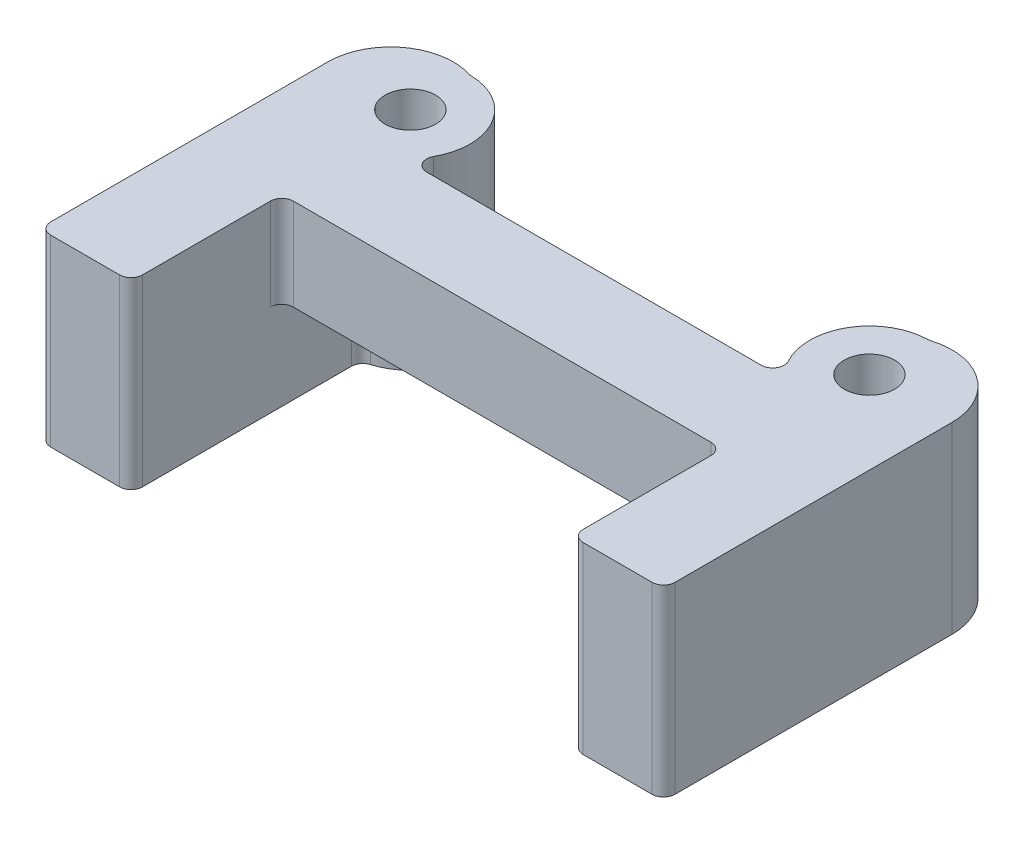
ISO-10303-21;
HEADER;
FILE_DESCRIPTION(('STEP AP214'),'2;1');
FILE_NAME('part.step','',(''),(''),'','','');
FILE_SCHEMA(('AUTOMOTIVE_DESIGN { 1 0 10303 214 1 1 1 1 }'));
ENDSEC;
DATA;
#1=APPLICATION_CONTEXT('core data for automotive mechanical design processes');
#2=APPLICATION_PROTOCOL_DEFINITION('international standard','automotive_design',2000,#1);
#3=PRODUCT_CONTEXT('',#1,'mechanical');
#4=PRODUCT('Part','Part','',(#3));
#5=PRODUCT_RELATED_PRODUCT_CATEGORY('part','',(#4));
#6=PRODUCT_DEFINITION_FORMATION('','',#4);
#7=PRODUCT_DEFINITION_CONTEXT('part definition',#1,'design');
#8=PRODUCT_DEFINITION('design','',#6,#7);
#9=PRODUCT_DEFINITION_SHAPE('','',#8);
#10=(LENGTH_UNIT() NAMED_UNIT(*) SI_UNIT(.MILLI.,.METRE.));
#11=(NAMED_UNIT(*) PLANE_ANGLE_UNIT() SI_UNIT($,.RADIAN.));
#12=(NAMED_UNIT(*) SI_UNIT($,.STERADIAN.) SOLID_ANGLE_UNIT());
#13=UNCERTAINTY_MEASURE_WITH_UNIT(LENGTH_MEASURE(1.E-05),#10,'distance_accuracy_value','');
#14=(GEOMETRIC_REPRESENTATION_CONTEXT(3) GLOBAL_UNCERTAINTY_ASSIGNED_CONTEXT((#13)) GLOBAL_UNIT_ASSIGNED_CONTEXT((#10,
#11,#12)) REPRESENTATION_CONTEXT('',''));
#15=CARTESIAN_POINT('',(0.,0.,0.));
#16=DIRECTION('',(0.,0.,1.));
#17=DIRECTION('',(1.,0.,0.));
#18=AXIS2_PLACEMENT_3D('',#15,#16,#17);
#19=CARTESIAN_POINT('',(0.861111111111111,8.,0.));
#20=DIRECTION('',(0.,-1.,0.));
#21=DIRECTION('',(0.,0.,-1.));
#22=AXIS2_PLACEMENT_3D('',#19,#20,#21);
#23=PLANE('',#22);
#24=DIRECTION('',(1.,0.,0.));
#25=VECTOR('',#24,1.);
#26=CARTESIAN_POINT('',(3.6,8.,12.569046515733));
#27=LINE('',#26,#25);
#28=CARTESIAN_POINT('',(0.0999999999999998,8.,12.569046515733));
#29=VERTEX_POINT('',#28);
#30=CARTESIAN_POINT('',(3.1,8.,12.569046515733));
#31=VERTEX_POINT('',#30);
#32=EDGE_CURVE('E318',#29,#31,#27,.T.);
#33=ORIENTED_EDGE('',*,*,#32,.T.);
#34=CARTESIAN_POINT('',(3.1,8.,12.069046515733));
#35=DIRECTION('',(0.,-1.,0.));
#36=DIRECTION('',(0.,0.,-1.));
#37=AXIS2_PLACEMENT_3D('',#34,#35,#36);
#38=CIRCLE('',#37,0.5);
#39=CARTESIAN_POINT('',(3.6,8.,12.069046515733));
#40=VERTEX_POINT('',#39);
#41=EDGE_CURVE('E434',#31,#40,#38,.F.);
#42=ORIENTED_EDGE('',*,*,#41,.T.);
#43=DIRECTION('',(0.,0.,-1.));
#44=VECTOR('',#43,1.);
#45=CARTESIAN_POINT('',(3.6,8.,0.));
#46=LINE('',#45,#44);
#47=CARTESIAN_POINT('',(3.6,8.,0.));
#48=VERTEX_POINT('',#47);
#49=EDGE_CURVE('E321',#40,#48,#46,.T.);
#50=ORIENTED_EDGE('',*,*,#49,.T.);
#51=CARTESIAN_POINT('',(0.861111111111111,8.,0.));
#52=DIRECTION('',(0.,1.,0.));
#53=DIRECTION('',(0.,0.,-1.));
#54=AXIS2_PLACEMENT_3D('',#51,#52,#53);
#55=CIRCLE('',#54,2.73888888888889);
#56=CARTESIAN_POINT('',(0.0647374536601564,8.,-2.62055363299384));
#57=VERTEX_POINT('',#56);
#58=EDGE_CURVE('E305',#48,#57,#55,.T.);
#59=ORIENTED_EDGE('',*,*,#58,.T.);
#60=CARTESIAN_POINT('',(-0.0806451612903224,8.,-3.098950847942));
#61=DIRECTION('',(0.,-1.,0.));
#62=DIRECTION('',(0.,0.,-1.));
#63=AXIS2_PLACEMENT_3D('',#60,#61,#62);
#64=CIRCLE('',#63,0.5);
#65=CARTESIAN_POINT('',(-0.0676378772112381,8.,-2.59912006601587));
#66=VERTEX_POINT('',#65);
#67=EDGE_CURVE('E465',#57,#66,#64,.T.);
#68=ORIENTED_EDGE('',*,*,#67,.T.);
#69=CARTESIAN_POINT('',(0.,8.,0.));
#70=DIRECTION('',(0.,1.,0.));
#71=DIRECTION('',(0.,0.,1.));
#72=AXIS2_PLACEMENT_3D('',#69,#70,#71);
#73=CIRCLE('',#72,2.6);
#74=CARTESIAN_POINT('',(-2.27536231691944,8.,1.25806451612903));
#75=VERTEX_POINT('',#74);
#76=EDGE_CURVE('E309',#66,#75,#73,.T.);
#77=ORIENTED_EDGE('',*,*,#76,.T.);
#78=CARTESIAN_POINT('',(-2.71293199325011,8.,1.5));
#79=DIRECTION('',(0.,-1.,0.));
#80=DIRECTION('',(0.,0.,-1.));
#81=AXIS2_PLACEMENT_3D('',#78,#79,#80);
#82=CIRCLE('',#81,0.5);
#83=CARTESIAN_POINT('',(-2.71293199325011,8.,2.));
#84=VERTEX_POINT('',#83);
#85=EDGE_CURVE('E480',#75,#84,#82,.T.);
#86=ORIENTED_EDGE('',*,*,#85,.T.);
#87=DIRECTION('',(-1.,0.,0.));
#88=VECTOR('',#87,1.);
#89=CARTESIAN_POINT('',(0.,8.,2.));
#90=LINE('',#89,#88);
#91=CARTESIAN_POINT('',(-17.2870680067499,8.,2.));
#92=VERTEX_POINT('',#91);
#93=EDGE_CURVE('E279',#84,#92,#90,.T.);
#94=ORIENTED_EDGE('',*,*,#93,.T.);
#95=CARTESIAN_POINT('',(-17.2870680067499,8.,1.5));
#96=DIRECTION('',(0.,-1.,0.));
#97=DIRECTION('',(0.,0.,-1.));
#98=AXIS2_PLACEMENT_3D('',#95,#96,#97);
#99=CIRCLE('',#98,0.5);
#100=CARTESIAN_POINT('',(-17.7246376830806,8.,1.25806451612904));
#101=VERTEX_POINT('',#100);
#102=EDGE_CURVE('E474',#92,#101,#99,.T.);
#103=ORIENTED_EDGE('',*,*,#102,.T.);
#104=CARTESIAN_POINT('',(-20.,8.,0.));
#105=DIRECTION('',(0.,-1.,0.));
#106=DIRECTION('',(0.,0.,1.));
#107=AXIS2_PLACEMENT_3D('',#104,#105,#106);
#108=CIRCLE('',#107,2.6);
#109=CARTESIAN_POINT('',(-19.9323621227888,8.,-2.59912006601587));
#110=VERTEX_POINT('',#109);
#111=EDGE_CURVE('E241',#110,#101,#108,.T.);
#112=ORIENTED_EDGE('',*,*,#111,.F.);
#113=CARTESIAN_POINT('',(-19.9193548387097,8.,-3.098950847942));
#114=DIRECTION('',(0.,-1.,0.));
#115=DIRECTION('',(0.,0.,-1.));
#116=AXIS2_PLACEMENT_3D('',#113,#114,#115);
#117=CIRCLE('',#116,0.5);
#118=CARTESIAN_POINT('',(-20.0647374536602,8.,-2.62055363299384));
#119=VERTEX_POINT('',#118);
#120=EDGE_CURVE('E239',#110,#119,#117,.T.);
#121=ORIENTED_EDGE('',*,*,#120,.T.);
#122=CARTESIAN_POINT('',(-20.8611111111111,8.,0.));
#123=DIRECTION('',(0.,-1.,0.));
#124=DIRECTION('',(0.,0.,-1.));
#125=AXIS2_PLACEMENT_3D('',#122,#123,#124);
#126=CIRCLE('',#125,2.73888888888889);
#127=CARTESIAN_POINT('',(-23.6,8.,0.));
#128=VERTEX_POINT('',#127);
#129=EDGE_CURVE('E228',#128,#119,#126,.T.);
#130=ORIENTED_EDGE('',*,*,#129,.F.);
#131=DIRECTION('',(0.,0.,-1.));
#132=VECTOR('',#131,1.);
#133=CARTESIAN_POINT('',(-23.6,8.,0.));
#134=LINE('',#133,#132);
#135=CARTESIAN_POINT('',(-23.6,8.,12.069046515733));
#136=VERTEX_POINT('',#135);
#137=EDGE_CURVE('E212',#136,#128,#134,.T.);
#138=ORIENTED_EDGE('',*,*,#137,.F.);
#139=CARTESIAN_POINT('',(-23.1,8.,12.069046515733));
#140=DIRECTION('',(0.,-1.,0.));
#141=DIRECTION('',(0.,0.,-1.));
#142=AXIS2_PLACEMENT_3D('',#139,#140,#141);
#143=CIRCLE('',#142,0.5);
#144=CARTESIAN_POINT('',(-23.1,8.,12.569046515733));
#145=VERTEX_POINT('',#144);
#146=EDGE_CURVE('E428',#136,#145,#143,.F.);
#147=ORIENTED_EDGE('',*,*,#146,.T.);
#148=DIRECTION('',(-1.,0.,0.));
#149=VECTOR('',#148,1.);
#150=CARTESIAN_POINT('',(-23.6,8.,12.569046515733));
#151=LINE('',#150,#149);
#152=CARTESIAN_POINT('',(-20.1,8.,12.569046515733));
#153=VERTEX_POINT('',#152);
#154=EDGE_CURVE('E222',#153,#145,#151,.T.);
#155=ORIENTED_EDGE('',*,*,#154,.F.);
#156=CARTESIAN_POINT('',(-20.1,8.,12.069046515733));
#157=DIRECTION('',(0.,-1.,0.));
#158=DIRECTION('',(0.,0.,-1.));
#159=AXIS2_PLACEMENT_3D('',#156,#157,#158);
#160=CIRCLE('',#159,0.5);
#161=CARTESIAN_POINT('',(-19.6,8.,12.069046515733));
#162=VERTEX_POINT('',#161);
#163=EDGE_CURVE('E425',#153,#162,#160,.F.);
#164=ORIENTED_EDGE('',*,*,#163,.T.);
#165=DIRECTION('',(0.,0.,1.));
#166=VECTOR('',#165,1.);
#167=CARTESIAN_POINT('',(-19.6,8.,12.569046515733));
#168=LINE('',#167,#166);
#169=CARTESIAN_POINT('',(-19.6,8.,6.5));
#170=VERTEX_POINT('',#169);
#171=EDGE_CURVE('E247',#170,#162,#168,.T.);
#172=ORIENTED_EDGE('',*,*,#171,.F.);
#173=CARTESIAN_POINT('',(-19.1,8.,6.5));
#174=DIRECTION('',(0.,-1.,0.));
#175=DIRECTION('',(0.,0.,-1.));
#176=AXIS2_PLACEMENT_3D('',#173,#174,#175);
#177=CIRCLE('',#176,0.5);
#178=CARTESIAN_POINT('',(-19.1,8.,6.));
#179=VERTEX_POINT('',#178);
#180=EDGE_CURVE('E47',#170,#179,#177,.T.);
#181=ORIENTED_EDGE('',*,*,#180,.T.);
#182=DIRECTION('',(1.,0.,0.));
#183=VECTOR('',#182,1.);
#184=CARTESIAN_POINT('',(0.,8.,6.));
#185=LINE('',#184,#183);
#186=CARTESIAN_POINT('',(-0.9,8.,6.));
#187=VERTEX_POINT('',#186);
#188=EDGE_CURVE('E233',#179,#187,#185,.T.);
#189=ORIENTED_EDGE('',*,*,#188,.T.);
#190=CARTESIAN_POINT('',(-0.9,8.,6.5));
#191=DIRECTION('',(0.,-1.,0.));
#192=DIRECTION('',(0.,0.,-1.));
#193=AXIS2_PLACEMENT_3D('',#190,#191,#192);
#194=CIRCLE('',#193,0.5);
#195=CARTESIAN_POINT('',(-0.4,8.,6.5));
#196=VERTEX_POINT('',#195);
#197=EDGE_CURVE('E487',#187,#196,#194,.T.);
#198=ORIENTED_EDGE('',*,*,#197,.T.);
#199=DIRECTION('',(0.,0.,1.));
#200=VECTOR('',#199,1.);
#201=CARTESIAN_POINT('',(-0.4,8.,12.569046515733));
#202=LINE('',#201,#200);
#203=CARTESIAN_POINT('',(-0.4,8.,12.069046515733));
#204=VERTEX_POINT('',#203);
#205=EDGE_CURVE('E314',#196,#204,#202,.T.);
#206=ORIENTED_EDGE('',*,*,#205,.T.);
#207=CARTESIAN_POINT('',(0.0999999999999998,8.,12.069046515733));
#208=DIRECTION('',(0.,-1.,0.));
#209=DIRECTION('',(0.,0.,-1.));
#210=AXIS2_PLACEMENT_3D('',#207,#208,#209);
#211=CIRCLE('',#210,0.5);
#212=EDGE_CURVE('E431',#204,#29,#211,.F.);
#213=ORIENTED_EDGE('',*,*,#212,.T.);
#214=EDGE_LOOP('',(#33,#42,#50,#59,#68,#77,#86,#94,#103,#112,#121,#130,#138,#147,#155,#164,#172,
#181,#189,#198,#206,#213));
#215=FACE_BOUND('',#214,.T.);
#216=CARTESIAN_POINT('',(0.,8.,0.));
#217=DIRECTION('',(0.,1.,0.));
#218=DIRECTION('',(0.,0.,1.));
#219=AXIS2_PLACEMENT_3D('',#216,#217,#218);
#220=CIRCLE('',#219,1.1);
#221=CARTESIAN_POINT('',(0.,8.,1.1));
#222=VERTEX_POINT('',#221);
#223=EDGE_CURVE('E297',#222,#222,#220,.T.);
#224=ORIENTED_EDGE('',*,*,#223,.F.);
#225=EDGE_LOOP('',(#224));
#226=FACE_BOUND('',#225,.T.);
#227=CARTESIAN_POINT('',(-20.,8.,0.));
#228=DIRECTION('',(0.,-1.,0.));
#229=DIRECTION('',(0.,0.,1.));
#230=AXIS2_PLACEMENT_3D('',#227,#228,#229);
#231=CIRCLE('',#230,1.1);
#232=CARTESIAN_POINT('',(-20.,8.,1.1));
#233=VERTEX_POINT('',#232);
#234=EDGE_CURVE('E264',#233,#233,#231,.T.);
#235=ORIENTED_EDGE('',*,*,#234,.T.);
#236=EDGE_LOOP('',(#235));
#237=FACE_BOUND('',#236,.T.);
#238=ADVANCED_FACE('F38',(#215,#226,#237),#23,.F.);
#239=CARTESIAN_POINT('',(0.861111111111111,0.,0.));
#240=DIRECTION('',(0.,-1.,0.));
#241=DIRECTION('',(0.,0.,-1.));
#242=AXIS2_PLACEMENT_3D('',#239,#240,#241);
#243=PLANE('',#242);
#244=DIRECTION('',(0.,0.,-1.));
#245=VECTOR('',#244,1.);
#246=CARTESIAN_POINT('',(3.6,0.,0.));
#247=LINE('',#246,#245);
#248=CARTESIAN_POINT('',(3.6,0.,12.069046515733));
#249=VERTEX_POINT('',#248);
#250=CARTESIAN_POINT('',(3.6,0.,0.));
#251=VERTEX_POINT('',#250);
#252=EDGE_CURVE('E310',#249,#251,#247,.T.);
#253=ORIENTED_EDGE('',*,*,#252,.F.);
#254=CARTESIAN_POINT('',(3.1,0.,12.069046515733));
#255=DIRECTION('',(0.,-1.,0.));
#256=DIRECTION('',(0.,0.,-1.));
#257=AXIS2_PLACEMENT_3D('',#254,#255,#256);
#258=CIRCLE('',#257,0.5);
#259=CARTESIAN_POINT('',(3.1,0.,12.569046515733));
#260=VERTEX_POINT('',#259);
#261=EDGE_CURVE('E415',#249,#260,#258,.T.);
#262=ORIENTED_EDGE('',*,*,#261,.T.);
#263=DIRECTION('',(1.,0.,0.));
#264=VECTOR('',#263,1.);
#265=CARTESIAN_POINT('',(3.6,0.,12.569046515733));
#266=LINE('',#265,#264);
#267=CARTESIAN_POINT('',(0.0999999999999998,0.,12.569046515733));
#268=VERTEX_POINT('',#267);
#269=EDGE_CURVE('E336',#268,#260,#266,.T.);
#270=ORIENTED_EDGE('',*,*,#269,.F.);
#271=CARTESIAN_POINT('',(0.0999999999999998,0.,12.069046515733));
#272=DIRECTION('',(0.,-1.,0.));
#273=DIRECTION('',(0.,0.,-1.));
#274=AXIS2_PLACEMENT_3D('',#271,#272,#273);
#275=CIRCLE('',#274,0.5);
#276=CARTESIAN_POINT('',(-0.4,0.,12.069046515733));
#277=VERTEX_POINT('',#276);
#278=EDGE_CURVE('E412',#268,#277,#275,.T.);
#279=ORIENTED_EDGE('',*,*,#278,.T.);
#280=DIRECTION('',(0.,0.,1.));
#281=VECTOR('',#280,1.);
#282=CARTESIAN_POINT('',(-0.4,0.,12.569046515733));
#283=LINE('',#282,#281);
#284=CARTESIAN_POINT('',(-0.4,0.,2.96647939483827));
#285=VERTEX_POINT('',#284);
#286=EDGE_CURVE('E332',#285,#277,#283,.T.);
#287=ORIENTED_EDGE('',*,*,#286,.F.);
#288=CARTESIAN_POINT('',(-0.9,0.,2.96647939483827));
#289=DIRECTION('',(0.,-1.,0.));
#290=DIRECTION('',(0.,0.,-1.));
#291=AXIS2_PLACEMENT_3D('',#288,#289,#290);
#292=CIRCLE('',#291,0.5);
#293=CARTESIAN_POINT('',(-0.75483870967742,0.,2.48801497631596));
#294=VERTEX_POINT('',#293);
#295=EDGE_CURVE('E468',#285,#294,#292,.F.);
#296=ORIENTED_EDGE('',*,*,#295,.T.);
#297=CARTESIAN_POINT('',(0.,0.,0.));
#298=DIRECTION('',(0.,1.,0.));
#299=DIRECTION('',(0.,0.,1.));
#300=AXIS2_PLACEMENT_3D('',#297,#298,#299);
#301=CIRCLE('',#300,2.6);
#302=CARTESIAN_POINT('',(-0.0676378772112381,0.,-2.59912006601587));
#303=VERTEX_POINT('',#302);
#304=EDGE_CURVE('E328',#303,#294,#301,.T.);
#305=ORIENTED_EDGE('',*,*,#304,.F.);
#306=CARTESIAN_POINT('',(-0.0806451612903224,0.,-3.098950847942));
#307=DIRECTION('',(0.,-1.,0.));
#308=DIRECTION('',(0.,0.,-1.));
#309=AXIS2_PLACEMENT_3D('',#306,#307,#308);
#310=CIRCLE('',#309,0.5);
#311=CARTESIAN_POINT('',(0.0647374536601564,0.,-2.62055363299384));
#312=VERTEX_POINT('',#311);
#313=EDGE_CURVE('E462',#303,#312,#310,.F.);
#314=ORIENTED_EDGE('',*,*,#313,.T.);
#315=CARTESIAN_POINT('',(0.861111111111111,0.,0.));
#316=DIRECTION('',(0.,1.,0.));
#317=DIRECTION('',(0.,0.,-1.));
#318=AXIS2_PLACEMENT_3D('',#315,#316,#317);
#319=CIRCLE('',#318,2.73888888888889);
#320=EDGE_CURVE('E301',#251,#312,#319,.T.);
#321=ORIENTED_EDGE('',*,*,#320,.F.);
#322=EDGE_LOOP('',(#253,#262,#270,#279,#287,#296,#305,#314,#321));
#323=FACE_BOUND('',#322,.T.);
#324=CARTESIAN_POINT('',(0.,0.,0.));
#325=DIRECTION('',(0.,1.,0.));
#326=DIRECTION('',(0.,0.,1.));
#327=AXIS2_PLACEMENT_3D('',#324,#325,#326);
#328=CIRCLE('',#327,1.1);
#329=CARTESIAN_POINT('',(0.,0.,1.1));
#330=VERTEX_POINT('',#329);
#331=EDGE_CURVE('E290',#330,#330,#328,.T.);
#332=ORIENTED_EDGE('',*,*,#331,.T.);
#333=EDGE_LOOP('',(#332));
#334=FACE_BOUND('',#333,.T.);
#335=ADVANCED_FACE('F552',(#323,#334),#243,.T.);
#336=CARTESIAN_POINT('',(0.861111111111111,8.,0.));
#337=DIRECTION('',(0.,-1.,0.));
#338=DIRECTION('',(0.,0.,-1.));
#339=AXIS2_PLACEMENT_3D('',#336,#337,#338);
#340=CYLINDRICAL_SURFACE('',#339,2.73888888888889);
#341=ORIENTED_EDGE('',*,*,#320,.T.);
#342=DIRECTION('',(0.,-1.,0.));
#343=VECTOR('',#342,1.);
#344=CARTESIAN_POINT('',(0.0647374536601561,8.,-2.62055363299384));
#345=LINE('',#344,#343);
#346=EDGE_CURVE('E370',#312,#57,#345,.F.);
#347=ORIENTED_EDGE('',*,*,#346,.T.);
#348=ORIENTED_EDGE('',*,*,#58,.F.);
#349=DIRECTION('',(0.,-1.,0.));
#350=VECTOR('',#349,1.);
#351=CARTESIAN_POINT('',(3.6,8.,0.));
#352=LINE('',#351,#350);
#353=EDGE_CURVE('E324',#48,#251,#352,.T.);
#354=ORIENTED_EDGE('',*,*,#353,.T.);
#355=EDGE_LOOP('',(#341,#347,#348,#354));
#356=FACE_BOUND('',#355,.T.);
#357=ADVANCED_FACE('F540',(#356),#340,.T.);
#358=CARTESIAN_POINT('',(0.,8.,0.));
#359=DIRECTION('',(0.,-1.,0.));
#360=DIRECTION('',(0.,0.,-1.));
#361=AXIS2_PLACEMENT_3D('',#358,#359,#360);
#362=CYLINDRICAL_SURFACE('',#361,2.6);
#363=ORIENTED_EDGE('',*,*,#76,.F.);
#364=DIRECTION('',(0.,-1.,0.));
#365=VECTOR('',#364,1.);
#366=CARTESIAN_POINT('',(-0.0676378772112381,8.,-2.59912006601587));
#367=LINE('',#366,#365);
#368=EDGE_CURVE('E366',#66,#303,#367,.T.);
#369=ORIENTED_EDGE('',*,*,#368,.T.);
#370=ORIENTED_EDGE('',*,*,#304,.T.);
#371=DIRECTION('',(0.,-1.,0.));
#372=VECTOR('',#371,1.);
#373=CARTESIAN_POINT('',(-0.75483870967742,8.,2.48801497631596));
#374=LINE('',#373,#372);
#375=CARTESIAN_POINT('',(-0.75483870967742,4.,2.48801497631596));
#376=VERTEX_POINT('',#375);
#377=EDGE_CURVE('E363',#294,#376,#374,.F.);
#378=ORIENTED_EDGE('',*,*,#377,.T.);
#379=CARTESIAN_POINT('',(0.,4.,0.));
#380=DIRECTION('',(0.,1.,0.));
#381=DIRECTION('',(0.,0.,1.));
#382=AXIS2_PLACEMENT_3D('',#379,#380,#381);
#383=CIRCLE('',#382,2.6);
#384=CARTESIAN_POINT('',(-2.27536231691944,4.,1.25806451612903));
#385=VERTEX_POINT('',#384);
#386=EDGE_CURVE('E282',#385,#376,#383,.T.);
#387=ORIENTED_EDGE('',*,*,#386,.F.);
#388=DIRECTION('',(0.,-1.,0.));
#389=VECTOR('',#388,1.);
#390=CARTESIAN_POINT('',(-2.27536231691944,8.,1.25806451612903));
#391=LINE('',#390,#389);
#392=EDGE_CURVE('E359',#385,#75,#391,.F.);
#393=ORIENTED_EDGE('',*,*,#392,.T.);
#394=EDGE_LOOP('',(#363,#369,#370,#378,#387,#393));
#395=FACE_BOUND('',#394,.T.);
#396=ADVANCED_FACE('F549',(#395),#362,.T.);
#397=CARTESIAN_POINT('',(-0.4,8.,12.569046515733));
#398=DIRECTION('',(1.,0.,0.));
#399=DIRECTION('',(0.,0.,-1.));
#400=AXIS2_PLACEMENT_3D('',#397,#398,#399);
#401=PLANE('',#400);
#402=DIRECTION('',(0.,0.,1.));
#403=VECTOR('',#402,1.);
#404=CARTESIAN_POINT('',(-0.4,4.,0.));
#405=LINE('',#404,#403);
#406=CARTESIAN_POINT('',(-0.4,4.,2.96647939483827));
#407=VERTEX_POINT('',#406);
#408=CARTESIAN_POINT('',(-0.4,4.,6.5));
#409=VERTEX_POINT('',#408);
#410=EDGE_CURVE('E278',#407,#409,#405,.T.);
#411=ORIENTED_EDGE('',*,*,#410,.F.);
#412=DIRECTION('',(0.,1.,0.));
#413=VECTOR('',#412,1.);
#414=CARTESIAN_POINT('',(-0.4,0.,2.96647939483827));
#415=LINE('',#414,#413);
#416=EDGE_CURVE('E380',#407,#285,#415,.F.);
#417=ORIENTED_EDGE('',*,*,#416,.T.);
#418=ORIENTED_EDGE('',*,*,#286,.T.);
#419=DIRECTION('',(0.,-1.,0.));
#420=VECTOR('',#419,1.);
#421=CARTESIAN_POINT('',(-0.4,8.,12.069046515733));
#422=LINE('',#421,#420);
#423=EDGE_CURVE('E377',#277,#204,#422,.F.);
#424=ORIENTED_EDGE('',*,*,#423,.T.);
#425=ORIENTED_EDGE('',*,*,#205,.F.);
#426=DIRECTION('',(0.,1.,0.));
#427=VECTOR('',#426,1.);
#428=CARTESIAN_POINT('',(-0.4,8.,6.5));
#429=LINE('',#428,#427);
#430=EDGE_CURVE('E373',#196,#409,#429,.F.);
#431=ORIENTED_EDGE('',*,*,#430,.T.);
#432=EDGE_LOOP('',(#411,#417,#418,#424,#425,#431));
#433=FACE_BOUND('',#432,.T.);
#434=ADVANCED_FACE('F517',(#433),#401,.F.);
#435=CARTESIAN_POINT('',(3.6,8.,12.569046515733));
#436=DIRECTION('',(0.,0.,-1.));
#437=DIRECTION('',(-1.,0.,0.));
#438=AXIS2_PLACEMENT_3D('',#435,#436,#437);
#439=PLANE('',#438);
#440=ORIENTED_EDGE('',*,*,#269,.T.);
#441=DIRECTION('',(0.,-1.,0.));
#442=VECTOR('',#441,1.);
#443=CARTESIAN_POINT('',(3.1,8.,12.569046515733));
#444=LINE('',#443,#442);
#445=EDGE_CURVE('E422',#260,#31,#444,.F.);
#446=ORIENTED_EDGE('',*,*,#445,.T.);
#447=ORIENTED_EDGE('',*,*,#32,.F.);
#448=DIRECTION('',(0.,-1.,0.));
#449=VECTOR('',#448,1.);
#450=CARTESIAN_POINT('',(0.0999999999999998,8.,12.569046515733));
#451=LINE('',#450,#449);
#452=EDGE_CURVE('E418',#29,#268,#451,.T.);
#453=ORIENTED_EDGE('',*,*,#452,.T.);
#454=EDGE_LOOP('',(#440,#446,#447,#453));
#455=FACE_BOUND('',#454,.T.);
#456=ADVANCED_FACE('F526',(#455),#439,.F.);
#457=CARTESIAN_POINT('',(3.6,8.,0.));
#458=DIRECTION('',(-1.,0.,0.));
#459=DIRECTION('',(0.,0.,1.));
#460=AXIS2_PLACEMENT_3D('',#457,#458,#459);
#461=PLANE('',#460);
#462=ORIENTED_EDGE('',*,*,#49,.F.);
#463=DIRECTION('',(0.,-1.,0.));
#464=VECTOR('',#463,1.);
#465=CARTESIAN_POINT('',(3.6,8.,12.069046515733));
#466=LINE('',#465,#464);
#467=EDGE_CURVE('E408',#40,#249,#466,.T.);
#468=ORIENTED_EDGE('',*,*,#467,.T.);
#469=ORIENTED_EDGE('',*,*,#252,.T.);
#470=ORIENTED_EDGE('',*,*,#353,.F.);
#471=EDGE_LOOP('',(#462,#468,#469,#470));
#472=FACE_BOUND('',#471,.T.);
#473=ADVANCED_FACE('F535',(#472),#461,.F.);
#474=CARTESIAN_POINT('',(0.,8.,0.));
#475=DIRECTION('',(0.,-1.,0.));
#476=DIRECTION('',(0.,0.,-1.));
#477=AXIS2_PLACEMENT_3D('',#474,#475,#476);
#478=CYLINDRICAL_SURFACE('',#477,1.1);
#479=ORIENTED_EDGE('',*,*,#223,.T.);
#480=EDGE_LOOP('',(#479));
#481=FACE_BOUND('',#480,.T.);
#482=ORIENTED_EDGE('',*,*,#331,.F.);
#483=EDGE_LOOP('',(#482));
#484=FACE_BOUND('',#483,.T.);
#485=ADVANCED_FACE('F587',(#481,#484),#478,.F.);
#486=CARTESIAN_POINT('',(0.,4.,2.));
#487=DIRECTION('',(0.,0.,-1.));
#488=DIRECTION('',(-1.,0.,0.));
#489=AXIS2_PLACEMENT_3D('',#486,#487,#488);
#490=PLANE('',#489);
#491=DIRECTION('',(-1.,0.,0.));
#492=VECTOR('',#491,1.);
#493=CARTESIAN_POINT('',(0.,4.,2.));
#494=LINE('',#493,#492);
#495=CARTESIAN_POINT('',(-2.71293199325011,4.,2.));
#496=VERTEX_POINT('',#495);
#497=CARTESIAN_POINT('',(-17.2870680067499,4.,2.));
#498=VERTEX_POINT('',#497);
#499=EDGE_CURVE('E286',#496,#498,#494,.T.);
#500=ORIENTED_EDGE('',*,*,#499,.T.);
#501=DIRECTION('',(0.,-1.,0.));
#502=VECTOR('',#501,1.);
#503=CARTESIAN_POINT('',(-17.2870680067499,4.,2.));
#504=LINE('',#503,#502);
#505=EDGE_CURVE('E404',#498,#92,#504,.F.);
#506=ORIENTED_EDGE('',*,*,#505,.T.);
#507=ORIENTED_EDGE('',*,*,#93,.F.);
#508=DIRECTION('',(0.,-1.,0.));
#509=VECTOR('',#508,1.);
#510=CARTESIAN_POINT('',(-2.71293199325011,4.,2.));
#511=LINE('',#510,#509);
#512=EDGE_CURVE('E401',#84,#496,#511,.T.);
#513=ORIENTED_EDGE('',*,*,#512,.T.);
#514=EDGE_LOOP('',(#500,#506,#507,#513));
#515=FACE_BOUND('',#514,.T.);
#516=ADVANCED_FACE('F565',(#515),#490,.T.);
#517=CARTESIAN_POINT('',(0.,4.,6.));
#518=DIRECTION('',(0.,0.,1.));
#519=DIRECTION('',(1.,0.,0.));
#520=AXIS2_PLACEMENT_3D('',#517,#518,#519);
#521=PLANE('',#520);
#522=DIRECTION('',(1.,0.,0.));
#523=VECTOR('',#522,1.);
#524=CARTESIAN_POINT('',(0.,4.,6.));
#525=LINE('',#524,#523);
#526=CARTESIAN_POINT('',(-19.1,4.,6.));
#527=VERTEX_POINT('',#526);
#528=CARTESIAN_POINT('',(-0.9,4.,6.));
#529=VERTEX_POINT('',#528);
#530=EDGE_CURVE('E274',#527,#529,#525,.T.);
#531=ORIENTED_EDGE('',*,*,#530,.T.);
#532=DIRECTION('',(0.,1.,0.));
#533=VECTOR('',#532,1.);
#534=CARTESIAN_POINT('',(-0.9,4.,6.));
#535=LINE('',#534,#533);
#536=EDGE_CURVE('E440',#529,#187,#535,.T.);
#537=ORIENTED_EDGE('',*,*,#536,.T.);
#538=ORIENTED_EDGE('',*,*,#188,.F.);
#539=DIRECTION('',(0.,1.,0.));
#540=VECTOR('',#539,1.);
#541=CARTESIAN_POINT('',(-19.1,4.,6.));
#542=LINE('',#541,#540);
#543=EDGE_CURVE('E437',#179,#527,#542,.F.);
#544=ORIENTED_EDGE('',*,*,#543,.T.);
#545=EDGE_LOOP('',(#531,#537,#538,#544));
#546=FACE_BOUND('',#545,.T.);
#547=ADVANCED_FACE('F499',(#546),#521,.T.);
#548=CARTESIAN_POINT('',(0.,4.,0.));
#549=DIRECTION('',(0.,1.,0.));
#550=DIRECTION('',(0.,0.,1.));
#551=AXIS2_PLACEMENT_3D('',#548,#549,#550);
#552=PLANE('',#551);
#553=ORIENTED_EDGE('',*,*,#386,.T.);
#554=CARTESIAN_POINT('',(-0.9,4.,2.96647939483827));
#555=DIRECTION('',(0.,1.,0.));
#556=DIRECTION('',(0.,0.,1.));
#557=AXIS2_PLACEMENT_3D('',#554,#555,#556);
#558=CIRCLE('',#557,0.5);
#559=EDGE_CURVE('E387',#376,#407,#558,.F.);
#560=ORIENTED_EDGE('',*,*,#559,.T.);
#561=ORIENTED_EDGE('',*,*,#410,.T.);
#562=CARTESIAN_POINT('',(-0.9,4.,6.5));
#563=DIRECTION('',(0.,1.,0.));
#564=DIRECTION('',(0.,0.,1.));
#565=AXIS2_PLACEMENT_3D('',#562,#563,#564);
#566=CIRCLE('',#565,0.5);
#567=EDGE_CURVE('E490',#409,#529,#566,.T.);
#568=ORIENTED_EDGE('',*,*,#567,.T.);
#569=ORIENTED_EDGE('',*,*,#530,.F.);
#570=CARTESIAN_POINT('',(-19.1,4.,6.5));
#571=DIRECTION('',(0.,1.,0.));
#572=DIRECTION('',(0.,0.,1.));
#573=AXIS2_PLACEMENT_3D('',#570,#571,#572);
#574=CIRCLE('',#573,0.5);
#575=CARTESIAN_POINT('',(-19.6,4.,6.5));
#576=VERTEX_POINT('',#575);
#577=EDGE_CURVE('E11',#527,#576,#574,.T.);
#578=ORIENTED_EDGE('',*,*,#577,.T.);
#579=DIRECTION('',(0.,0.,1.));
#580=VECTOR('',#579,1.);
#581=CARTESIAN_POINT('',(-19.6,4.,0.));
#582=LINE('',#581,#580);
#583=CARTESIAN_POINT('',(-19.6,4.,2.96647939483826));
#584=VERTEX_POINT('',#583);
#585=EDGE_CURVE('E507',#584,#576,#582,.T.);
#586=ORIENTED_EDGE('',*,*,#585,.F.);
#587=CARTESIAN_POINT('',(-19.1,4.,2.96647939483826));
#588=DIRECTION('',(0.,1.,0.));
#589=DIRECTION('',(0.,0.,1.));
#590=AXIS2_PLACEMENT_3D('',#587,#588,#589);
#591=CIRCLE('',#590,0.5);
#592=CARTESIAN_POINT('',(-19.2451612903226,4.,2.48801497631596));
#593=VERTEX_POINT('',#592);
#594=EDGE_CURVE('E384',#584,#593,#591,.F.);
#595=ORIENTED_EDGE('',*,*,#594,.T.);
#596=CARTESIAN_POINT('',(-20.,4.,0.));
#597=DIRECTION('',(0.,-1.,0.));
#598=DIRECTION('',(0.,0.,1.));
#599=AXIS2_PLACEMENT_3D('',#596,#597,#598);
#600=CIRCLE('',#599,2.6);
#601=CARTESIAN_POINT('',(-17.7246376830806,4.,1.25806451612904));
#602=VERTEX_POINT('',#601);
#603=EDGE_CURVE('E616',#602,#593,#600,.T.);
#604=ORIENTED_EDGE('',*,*,#603,.F.);
#605=CARTESIAN_POINT('',(-17.2870680067499,4.,1.5));
#606=DIRECTION('',(0.,1.,0.));
#607=DIRECTION('',(0.,0.,1.));
#608=AXIS2_PLACEMENT_3D('',#605,#606,#607);
#609=CIRCLE('',#608,0.5);
#610=EDGE_CURVE('E477',#602,#498,#609,.T.);
#611=ORIENTED_EDGE('',*,*,#610,.T.);
#612=ORIENTED_EDGE('',*,*,#499,.F.);
#613=CARTESIAN_POINT('',(-2.71293199325011,4.,1.5));
#614=DIRECTION('',(0.,1.,0.));
#615=DIRECTION('',(0.,0.,1.));
#616=AXIS2_PLACEMENT_3D('',#613,#614,#615);
#617=CIRCLE('',#616,0.5);
#618=EDGE_CURVE('E483',#496,#385,#617,.T.);
#619=ORIENTED_EDGE('',*,*,#618,.T.);
#620=EDGE_LOOP('',(#553,#560,#561,#568,#569,#578,#586,#595,#604,#611,#612,#619));
#621=FACE_BOUND('',#620,.T.);
#622=ADVANCED_FACE('F506',(#621),#552,.F.);
#623=CARTESIAN_POINT('',(-20.8611111111111,0.,0.));
#624=DIRECTION('',(0.,-1.,0.));
#625=DIRECTION('',(0.,0.,-1.));
#626=AXIS2_PLACEMENT_3D('',#623,#624,#625);
#627=PLANE('',#626);
#628=DIRECTION('',(-1.,0.,0.));
#629=VECTOR('',#628,1.);
#630=CARTESIAN_POINT('',(-23.6,0.,12.569046515733));
#631=LINE('',#630,#629);
#632=CARTESIAN_POINT('',(-20.1,0.,12.569046515733));
#633=VERTEX_POINT('',#632);
#634=CARTESIAN_POINT('',(-23.1,0.,12.569046515733));
#635=VERTEX_POINT('',#634);
#636=EDGE_CURVE('E249',#633,#635,#631,.T.);
#637=ORIENTED_EDGE('',*,*,#636,.T.);
#638=CARTESIAN_POINT('',(-23.1,0.,12.069046515733));
#639=DIRECTION('',(0.,-1.,0.));
#640=DIRECTION('',(0.,0.,-1.));
#641=AXIS2_PLACEMENT_3D('',#638,#639,#640);
#642=CIRCLE('',#641,0.5);
#643=CARTESIAN_POINT('',(-23.6,0.,12.069046515733));
#644=VERTEX_POINT('',#643);
#645=EDGE_CURVE('E54',#635,#644,#642,.T.);
#646=ORIENTED_EDGE('',*,*,#645,.T.);
#647=DIRECTION('',(0.,0.,-1.));
#648=VECTOR('',#647,1.);
#649=CARTESIAN_POINT('',(-23.6,0.,0.));
#650=LINE('',#649,#648);
#651=CARTESIAN_POINT('',(-23.6,0.,0.));
#652=VERTEX_POINT('',#651);
#653=EDGE_CURVE('E242',#644,#652,#650,.T.);
#654=ORIENTED_EDGE('',*,*,#653,.T.);
#655=CARTESIAN_POINT('',(-20.8611111111111,0.,0.));
#656=DIRECTION('',(0.,-1.,0.));
#657=DIRECTION('',(0.,0.,-1.));
#658=AXIS2_PLACEMENT_3D('',#655,#656,#657);
#659=CIRCLE('',#658,2.73888888888889);
#660=CARTESIAN_POINT('',(-20.0647374536602,0.,-2.62055363299384));
#661=VERTEX_POINT('',#660);
#662=EDGE_CURVE('E231',#652,#661,#659,.T.);
#663=ORIENTED_EDGE('',*,*,#662,.T.);
#664=CARTESIAN_POINT('',(-19.9193548387097,0.,-3.098950847942));
#665=DIRECTION('',(0.,-1.,0.));
#666=DIRECTION('',(0.,0.,-1.));
#667=AXIS2_PLACEMENT_3D('',#664,#665,#666);
#668=CIRCLE('',#667,0.5);
#669=CARTESIAN_POINT('',(-19.9323621227888,0.,-2.59912006601587));
#670=VERTEX_POINT('',#669);
#671=EDGE_CURVE('E457',#661,#670,#668,.F.);
#672=ORIENTED_EDGE('',*,*,#671,.T.);
#673=CARTESIAN_POINT('',(-20.,0.,0.));
#674=DIRECTION('',(0.,-1.,0.));
#675=DIRECTION('',(0.,0.,1.));
#676=AXIS2_PLACEMENT_3D('',#673,#674,#675);
#677=CIRCLE('',#676,2.6);
#678=CARTESIAN_POINT('',(-19.2451612903226,0.,2.48801497631596));
#679=VERTEX_POINT('',#678);
#680=EDGE_CURVE('E263',#670,#679,#677,.T.);
#681=ORIENTED_EDGE('',*,*,#680,.T.);
#682=CARTESIAN_POINT('',(-19.1,0.,2.96647939483826));
#683=DIRECTION('',(0.,-1.,0.));
#684=DIRECTION('',(0.,0.,-1.));
#685=AXIS2_PLACEMENT_3D('',#682,#683,#684);
#686=CIRCLE('',#685,0.5);
#687=CARTESIAN_POINT('',(-19.6,0.,2.96647939483826));
#688=VERTEX_POINT('',#687);
#689=EDGE_CURVE('E471',#679,#688,#686,.F.);
#690=ORIENTED_EDGE('',*,*,#689,.T.);
#691=DIRECTION('',(0.,0.,1.));
#692=VECTOR('',#691,1.);
#693=CARTESIAN_POINT('',(-19.6,0.,12.569046515733));
#694=LINE('',#693,#692);
#695=CARTESIAN_POINT('',(-19.6,0.,12.069046515733));
#696=VERTEX_POINT('',#695);
#697=EDGE_CURVE('E268',#688,#696,#694,.T.);
#698=ORIENTED_EDGE('',*,*,#697,.T.);
#699=CARTESIAN_POINT('',(-20.1,0.,12.069046515733));
#700=DIRECTION('',(0.,-1.,0.));
#701=DIRECTION('',(0.,0.,-1.));
#702=AXIS2_PLACEMENT_3D('',#699,#700,#701);
#703=CIRCLE('',#702,0.5);
#704=EDGE_CURVE('E450',#696,#633,#703,.T.);
#705=ORIENTED_EDGE('',*,*,#704,.T.);
#706=EDGE_LOOP('',(#637,#646,#654,#663,#672,#681,#690,#698,#705));
#707=FACE_BOUND('',#706,.T.);
#708=CARTESIAN_POINT('',(-20.,0.,0.));
#709=DIRECTION('',(0.,-1.,0.));
#710=DIRECTION('',(0.,0.,1.));
#711=AXIS2_PLACEMENT_3D('',#708,#709,#710);
#712=CIRCLE('',#711,1.1);
#713=CARTESIAN_POINT('',(-20.,0.,1.1));
#714=VERTEX_POINT('',#713);
#715=EDGE_CURVE('E252',#714,#714,#712,.T.);
#716=ORIENTED_EDGE('',*,*,#715,.F.);
#717=EDGE_LOOP('',(#716));
#718=FACE_BOUND('',#717,.T.);
#719=ADVANCED_FACE('F638',(#707,#718),#627,.T.);
#720=CARTESIAN_POINT('',(-20.8611111111111,8.,0.));
#721=DIRECTION('',(0.,-1.,0.));
#722=DIRECTION('',(0.,0.,-1.));
#723=AXIS2_PLACEMENT_3D('',#720,#721,#722);
#724=CYLINDRICAL_SURFACE('',#723,2.73888888888889);
#725=ORIENTED_EDGE('',*,*,#129,.T.);
#726=DIRECTION('',(0.,-1.,0.));
#727=VECTOR('',#726,1.);
#728=CARTESIAN_POINT('',(-20.0647374536602,8.,-2.62055363299384));
#729=LINE('',#728,#727);
#730=EDGE_CURVE('E345',#119,#661,#729,.T.);
#731=ORIENTED_EDGE('',*,*,#730,.T.);
#732=ORIENTED_EDGE('',*,*,#662,.F.);
#733=DIRECTION('',(0.,-1.,0.));
#734=VECTOR('',#733,1.);
#735=CARTESIAN_POINT('',(-23.6,8.,0.));
#736=LINE('',#735,#734);
#737=EDGE_CURVE('E215',#128,#652,#736,.T.);
#738=ORIENTED_EDGE('',*,*,#737,.F.);
#739=EDGE_LOOP('',(#725,#731,#732,#738));
#740=FACE_BOUND('',#739,.T.);
#741=ADVANCED_FACE('F226',(#740),#724,.T.);
#742=CARTESIAN_POINT('',(-20.,8.,0.));
#743=DIRECTION('',(0.,-1.,0.));
#744=DIRECTION('',(0.,0.,-1.));
#745=AXIS2_PLACEMENT_3D('',#742,#743,#744);
#746=CYLINDRICAL_SURFACE('',#745,2.6);
#747=ORIENTED_EDGE('',*,*,#680,.F.);
#748=DIRECTION('',(0.,-1.,0.));
#749=VECTOR('',#748,1.);
#750=CARTESIAN_POINT('',(-19.9323621227888,8.,-2.59912006601587));
#751=LINE('',#750,#749);
#752=EDGE_CURVE('E356',#670,#110,#751,.F.);
#753=ORIENTED_EDGE('',*,*,#752,.T.);
#754=ORIENTED_EDGE('',*,*,#111,.T.);
#755=DIRECTION('',(0.,-1.,0.));
#756=VECTOR('',#755,1.);
#757=CARTESIAN_POINT('',(-17.7246376830806,8.,1.25806451612904));
#758=LINE('',#757,#756);
#759=EDGE_CURVE('E348',#101,#602,#758,.T.);
#760=ORIENTED_EDGE('',*,*,#759,.T.);
#761=ORIENTED_EDGE('',*,*,#603,.T.);
#762=DIRECTION('',(0.,-1.,0.));
#763=VECTOR('',#762,1.);
#764=CARTESIAN_POINT('',(-19.2451612903226,8.,2.48801497631596));
#765=LINE('',#764,#763);
#766=EDGE_CURVE('E352',#593,#679,#765,.T.);
#767=ORIENTED_EDGE('',*,*,#766,.T.);
#768=EDGE_LOOP('',(#747,#753,#754,#760,#761,#767));
#769=FACE_BOUND('',#768,.T.);
#770=ADVANCED_FACE('F619',(#769),#746,.T.);
#771=CARTESIAN_POINT('',(-19.6,8.,12.569046515733));
#772=DIRECTION('',(-1.,0.,0.));
#773=DIRECTION('',(0.,0.,-1.));
#774=AXIS2_PLACEMENT_3D('',#771,#772,#773);
#775=PLANE('',#774);
#776=ORIENTED_EDGE('',*,*,#697,.F.);
#777=DIRECTION('',(0.,1.,0.));
#778=VECTOR('',#777,1.);
#779=CARTESIAN_POINT('',(-19.6,4.,2.96647939483826));
#780=LINE('',#779,#778);
#781=EDGE_CURVE('E398',#688,#584,#780,.T.);
#782=ORIENTED_EDGE('',*,*,#781,.T.);
#783=ORIENTED_EDGE('',*,*,#585,.T.);
#784=DIRECTION('',(0.,1.,0.));
#785=VECTOR('',#784,1.);
#786=CARTESIAN_POINT('',(-19.6,8.,6.5));
#787=LINE('',#786,#785);
#788=EDGE_CURVE('E394',#576,#170,#787,.T.);
#789=ORIENTED_EDGE('',*,*,#788,.T.);
#790=ORIENTED_EDGE('',*,*,#171,.T.);
#791=DIRECTION('',(0.,-1.,0.));
#792=VECTOR('',#791,1.);
#793=CARTESIAN_POINT('',(-19.6,8.,12.069046515733));
#794=LINE('',#793,#792);
#795=EDGE_CURVE('E390',#162,#696,#794,.T.);
#796=ORIENTED_EDGE('',*,*,#795,.T.);
#797=EDGE_LOOP('',(#776,#782,#783,#789,#790,#796));
#798=FACE_BOUND('',#797,.T.);
#799=ADVANCED_FACE('F653',(#798),#775,.F.);
#800=CARTESIAN_POINT('',(-23.6,8.,12.569046515733));
#801=DIRECTION('',(0.,0.,-1.));
#802=DIRECTION('',(1.,0.,0.));
#803=AXIS2_PLACEMENT_3D('',#800,#801,#802);
#804=PLANE('',#803);
#805=ORIENTED_EDGE('',*,*,#154,.T.);
#806=DIRECTION('',(0.,-1.,0.));
#807=VECTOR('',#806,1.);
#808=CARTESIAN_POINT('',(-23.1,8.,12.569046515733));
#809=LINE('',#808,#807);
#810=EDGE_CURVE('E447',#145,#635,#809,.T.);
#811=ORIENTED_EDGE('',*,*,#810,.T.);
#812=ORIENTED_EDGE('',*,*,#636,.F.);
#813=DIRECTION('',(0.,-1.,0.));
#814=VECTOR('',#813,1.);
#815=CARTESIAN_POINT('',(-20.1,8.,12.569046515733));
#816=LINE('',#815,#814);
#817=EDGE_CURVE('E444',#633,#153,#816,.F.);
#818=ORIENTED_EDGE('',*,*,#817,.T.);
#819=EDGE_LOOP('',(#805,#811,#812,#818));
#820=FACE_BOUND('',#819,.T.);
#821=ADVANCED_FACE('F650',(#820),#804,.F.);
#822=CARTESIAN_POINT('',(-23.6,8.,0.));
#823=DIRECTION('',(1.,0.,0.));
#824=DIRECTION('',(0.,0.,1.));
#825=AXIS2_PLACEMENT_3D('',#822,#823,#824);
#826=PLANE('',#825);
#827=ORIENTED_EDGE('',*,*,#653,.F.);
#828=DIRECTION('',(0.,-1.,0.));
#829=VECTOR('',#828,1.);
#830=CARTESIAN_POINT('',(-23.6,8.,12.069046515733));
#831=LINE('',#830,#829);
#832=EDGE_CURVE('E217',#644,#136,#831,.F.);
#833=ORIENTED_EDGE('',*,*,#832,.T.);
#834=ORIENTED_EDGE('',*,*,#137,.T.);
#835=ORIENTED_EDGE('',*,*,#737,.T.);
#836=EDGE_LOOP('',(#827,#833,#834,#835));
#837=FACE_BOUND('',#836,.T.);
#838=ADVANCED_FACE('F214',(#837),#826,.F.);
#839=CARTESIAN_POINT('',(-20.,8.,0.));
#840=DIRECTION('',(0.,-1.,0.));
#841=DIRECTION('',(0.,0.,-1.));
#842=AXIS2_PLACEMENT_3D('',#839,#840,#841);
#843=CYLINDRICAL_SURFACE('',#842,1.1);
#844=ORIENTED_EDGE('',*,*,#234,.F.);
#845=EDGE_LOOP('',(#844));
#846=FACE_BOUND('',#845,.T.);
#847=ORIENTED_EDGE('',*,*,#715,.T.);
#848=EDGE_LOOP('',(#847));
#849=FACE_BOUND('',#848,.T.);
#850=ADVANCED_FACE('F603',(#846,#849),#843,.F.);
#851=CARTESIAN_POINT('',(-19.9193548387097,8.,-3.098950847942));
#852=DIRECTION('',(0.,1.,0.));
#853=DIRECTION('',(0.,0.,1.));
#854=AXIS2_PLACEMENT_3D('',#851,#852,#853);
#855=CYLINDRICAL_SURFACE('',#854,0.5);
#856=ORIENTED_EDGE('',*,*,#120,.F.);
#857=ORIENTED_EDGE('',*,*,#752,.F.);
#858=ORIENTED_EDGE('',*,*,#671,.F.);
#859=ORIENTED_EDGE('',*,*,#730,.F.);
#860=EDGE_LOOP('',(#856,#857,#858,#859));
#861=FACE_BOUND('',#860,.T.);
#862=ADVANCED_FACE('F600',(#861),#855,.F.);
#863=CARTESIAN_POINT('',(-0.0806451612903224,8.,-3.098950847942));
#864=DIRECTION('',(0.,1.,0.));
#865=DIRECTION('',(0.,0.,1.));
#866=AXIS2_PLACEMENT_3D('',#863,#864,#865);
#867=CYLINDRICAL_SURFACE('',#866,0.5);
#868=ORIENTED_EDGE('',*,*,#67,.F.);
#869=ORIENTED_EDGE('',*,*,#346,.F.);
#870=ORIENTED_EDGE('',*,*,#313,.F.);
#871=ORIENTED_EDGE('',*,*,#368,.F.);
#872=EDGE_LOOP('',(#868,#869,#870,#871));
#873=FACE_BOUND('',#872,.T.);
#874=ADVANCED_FACE('F546',(#873),#867,.F.);
#875=CARTESIAN_POINT('',(-0.9,8.,2.96647939483827));
#876=DIRECTION('',(0.,-1.,0.));
#877=DIRECTION('',(0.,0.,-1.));
#878=AXIS2_PLACEMENT_3D('',#875,#876,#877);
#879=CYLINDRICAL_SURFACE('',#878,0.5);
#880=ORIENTED_EDGE('',*,*,#559,.F.);
#881=ORIENTED_EDGE('',*,*,#377,.F.);
#882=ORIENTED_EDGE('',*,*,#295,.F.);
#883=ORIENTED_EDGE('',*,*,#416,.F.);
#884=EDGE_LOOP('',(#880,#881,#882,#883));
#885=FACE_BOUND('',#884,.T.);
#886=ADVANCED_FACE('F557',(#885),#879,.F.);
#887=CARTESIAN_POINT('',(-19.1,8.,2.96647939483826));
#888=DIRECTION('',(0.,-1.,0.));
#889=DIRECTION('',(0.,0.,-1.));
#890=AXIS2_PLACEMENT_3D('',#887,#888,#889);
#891=CYLINDRICAL_SURFACE('',#890,0.5);
#892=ORIENTED_EDGE('',*,*,#594,.F.);
#893=ORIENTED_EDGE('',*,*,#781,.F.);
#894=ORIENTED_EDGE('',*,*,#689,.F.);
#895=ORIENTED_EDGE('',*,*,#766,.F.);
#896=EDGE_LOOP('',(#892,#893,#894,#895));
#897=FACE_BOUND('',#896,.T.);
#898=ADVANCED_FACE('F576',(#897),#891,.F.);
#899=CARTESIAN_POINT('',(-17.2870680067499,8.,1.5));
#900=DIRECTION('',(0.,-1.,0.));
#901=DIRECTION('',(0.,0.,-1.));
#902=AXIS2_PLACEMENT_3D('',#899,#900,#901);
#903=CYLINDRICAL_SURFACE('',#902,0.5);
#904=ORIENTED_EDGE('',*,*,#610,.F.);
#905=ORIENTED_EDGE('',*,*,#759,.F.);
#906=ORIENTED_EDGE('',*,*,#102,.F.);
#907=ORIENTED_EDGE('',*,*,#505,.F.);
#908=EDGE_LOOP('',(#904,#905,#906,#907));
#909=FACE_BOUND('',#908,.T.);
#910=ADVANCED_FACE('F569',(#909),#903,.F.);
#911=CARTESIAN_POINT('',(-2.71293199325011,8.,1.5));
#912=DIRECTION('',(0.,-1.,0.));
#913=DIRECTION('',(0.,0.,-1.));
#914=AXIS2_PLACEMENT_3D('',#911,#912,#913);
#915=CYLINDRICAL_SURFACE('',#914,0.5);
#916=ORIENTED_EDGE('',*,*,#618,.F.);
#917=ORIENTED_EDGE('',*,*,#512,.F.);
#918=ORIENTED_EDGE('',*,*,#85,.F.);
#919=ORIENTED_EDGE('',*,*,#392,.F.);
#920=EDGE_LOOP('',(#916,#917,#918,#919));
#921=FACE_BOUND('',#920,.T.);
#922=ADVANCED_FACE('F567',(#921),#915,.F.);
#923=CARTESIAN_POINT('',(3.1,8.,12.069046515733));
#924=DIRECTION('',(0.,-1.,0.));
#925=DIRECTION('',(0.,0.,-1.));
#926=AXIS2_PLACEMENT_3D('',#923,#924,#925);
#927=CYLINDRICAL_SURFACE('',#926,0.5);
#928=ORIENTED_EDGE('',*,*,#41,.F.);
#929=ORIENTED_EDGE('',*,*,#445,.F.);
#930=ORIENTED_EDGE('',*,*,#261,.F.);
#931=ORIENTED_EDGE('',*,*,#467,.F.);
#932=EDGE_LOOP('',(#928,#929,#930,#931));
#933=FACE_BOUND('',#932,.T.);
#934=ADVANCED_FACE('F530',(#933),#927,.T.);
#935=CARTESIAN_POINT('',(0.0999999999999998,8.,12.069046515733));
#936=DIRECTION('',(0.,-1.,0.));
#937=DIRECTION('',(0.,0.,-1.));
#938=AXIS2_PLACEMENT_3D('',#935,#936,#937);
#939=CYLINDRICAL_SURFACE('',#938,0.5);
#940=ORIENTED_EDGE('',*,*,#212,.F.);
#941=ORIENTED_EDGE('',*,*,#423,.F.);
#942=ORIENTED_EDGE('',*,*,#278,.F.);
#943=ORIENTED_EDGE('',*,*,#452,.F.);
#944=EDGE_LOOP('',(#940,#941,#942,#943));
#945=FACE_BOUND('',#944,.T.);
#946=ADVANCED_FACE('F521',(#945),#939,.T.);
#947=CARTESIAN_POINT('',(-0.9,4.,6.5));
#948=DIRECTION('',(0.,1.,0.));
#949=DIRECTION('',(0.,0.,1.));
#950=AXIS2_PLACEMENT_3D('',#947,#948,#949);
#951=CYLINDRICAL_SURFACE('',#950,0.5);
#952=ORIENTED_EDGE('',*,*,#567,.F.);
#953=ORIENTED_EDGE('',*,*,#430,.F.);
#954=ORIENTED_EDGE('',*,*,#197,.F.);
#955=ORIENTED_EDGE('',*,*,#536,.F.);
#956=EDGE_LOOP('',(#952,#953,#954,#955));
#957=FACE_BOUND('',#956,.T.);
#958=ADVANCED_FACE('F511',(#957),#951,.F.);
#959=CARTESIAN_POINT('',(-19.1,8.,6.5));
#960=DIRECTION('',(0.,1.,0.));
#961=DIRECTION('',(0.,0.,1.));
#962=AXIS2_PLACEMENT_3D('',#959,#960,#961);
#963=CYLINDRICAL_SURFACE('',#962,0.5);
#964=ORIENTED_EDGE('',*,*,#577,.F.);
#965=ORIENTED_EDGE('',*,*,#543,.F.);
#966=ORIENTED_EDGE('',*,*,#180,.F.);
#967=ORIENTED_EDGE('',*,*,#788,.F.);
#968=EDGE_LOOP('',(#964,#965,#966,#967));
#969=FACE_BOUND('',#968,.T.);
#970=ADVANCED_FACE('F503',(#969),#963,.F.);
#971=CARTESIAN_POINT('',(-23.1,8.,12.069046515733));
#972=DIRECTION('',(0.,-1.,0.));
#973=DIRECTION('',(0.,0.,-1.));
#974=AXIS2_PLACEMENT_3D('',#971,#972,#973);
#975=CYLINDRICAL_SURFACE('',#974,0.5);
#976=ORIENTED_EDGE('',*,*,#146,.F.);
#977=ORIENTED_EDGE('',*,*,#832,.F.);
#978=ORIENTED_EDGE('',*,*,#645,.F.);
#979=ORIENTED_EDGE('',*,*,#810,.F.);
#980=EDGE_LOOP('',(#976,#977,#978,#979));
#981=FACE_BOUND('',#980,.T.);
#982=ADVANCED_FACE('F768',(#981),#975,.T.);
#983=CARTESIAN_POINT('',(-20.1,8.,12.069046515733));
#984=DIRECTION('',(0.,-1.,0.));
#985=DIRECTION('',(0.,0.,-1.));
#986=AXIS2_PLACEMENT_3D('',#983,#984,#985);
#987=CYLINDRICAL_SURFACE('',#986,0.5);
#988=ORIENTED_EDGE('',*,*,#163,.F.);
#989=ORIENTED_EDGE('',*,*,#817,.F.);
#990=ORIENTED_EDGE('',*,*,#704,.F.);
#991=ORIENTED_EDGE('',*,*,#795,.F.);
#992=EDGE_LOOP('',(#988,#989,#990,#991));
#993=FACE_BOUND('',#992,.T.);
#994=ADVANCED_FACE('F40',(#993),#987,.T.);
#995=CLOSED_SHELL('',(#238,#335,#357,#396,#434,#456,#473,#485,#516,#547,#622,#719,#741,#770,
#799,#821,#838,#850,#862,#874,#886,#898,#910,#922,#934,#946,#958,#970,#982,#994));
#996=MANIFOLD_SOLID_BREP('B2',#995);
#997=ADVANCED_BREP_SHAPE_REPRESENTATION('',(#18,#996),#14);
#998=SHAPE_DEFINITION_REPRESENTATION(#9,#997);
ENDSEC;
END-ISO-10303-21;
